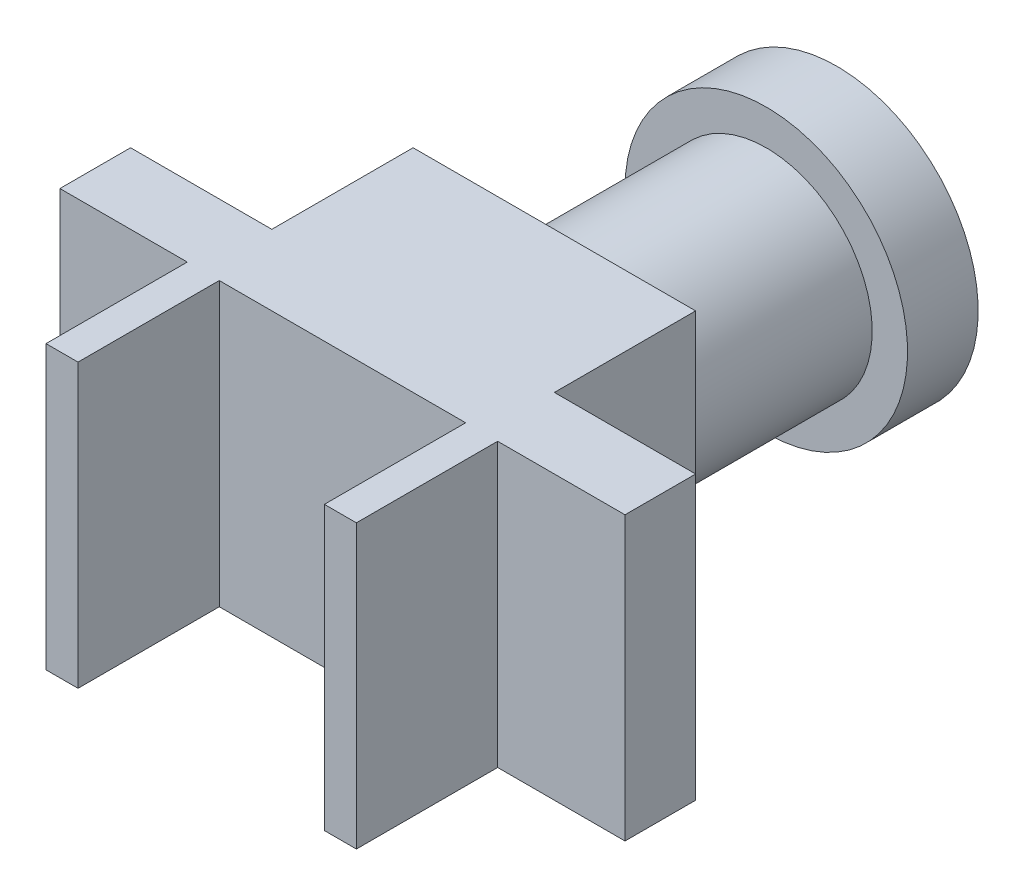
ISO-10303-21;
HEADER;
FILE_DESCRIPTION(('STEP AP214'),'2;1');
FILE_NAME('part.step','',(''),(''),'','','');
FILE_SCHEMA(('AUTOMOTIVE_DESIGN { 1 0 10303 214 1 1 1 1 }'));
ENDSEC;
DATA;
#1=APPLICATION_CONTEXT('core data for automotive mechanical design processes');
#2=APPLICATION_PROTOCOL_DEFINITION('international standard','automotive_design',2000,#1);
#3=PRODUCT_CONTEXT('',#1,'mechanical');
#4=PRODUCT('Part','Part','',(#3));
#5=PRODUCT_RELATED_PRODUCT_CATEGORY('part','',(#4));
#6=PRODUCT_DEFINITION_FORMATION('','',#4);
#7=PRODUCT_DEFINITION_CONTEXT('part definition',#1,'design');
#8=PRODUCT_DEFINITION('design','',#6,#7);
#9=PRODUCT_DEFINITION_SHAPE('','',#8);
#10=(LENGTH_UNIT() NAMED_UNIT(*) SI_UNIT(.MILLI.,.METRE.));
#11=(NAMED_UNIT(*) PLANE_ANGLE_UNIT() SI_UNIT($,.RADIAN.));
#12=(NAMED_UNIT(*) SI_UNIT($,.STERADIAN.) SOLID_ANGLE_UNIT());
#13=UNCERTAINTY_MEASURE_WITH_UNIT(LENGTH_MEASURE(1.E-05),#10,'distance_accuracy_value','');
#14=(GEOMETRIC_REPRESENTATION_CONTEXT(3) GLOBAL_UNCERTAINTY_ASSIGNED_CONTEXT((#13)) GLOBAL_UNIT_ASSIGNED_CONTEXT((#10,
#11,#12)) REPRESENTATION_CONTEXT('',''));
#15=CARTESIAN_POINT('',(0.,0.,0.));
#16=DIRECTION('',(0.,0.,1.));
#17=DIRECTION('',(1.,0.,0.));
#18=AXIS2_PLACEMENT_3D('',#15,#16,#17);
#19=CARTESIAN_POINT('',(0.,0.,45.));
#20=DIRECTION('',(0.,0.,-1.));
#21=DIRECTION('',(-1.,0.,0.));
#22=AXIS2_PLACEMENT_3D('',#19,#20,#21);
#23=PLANE('',#22);
#24=DIRECTION('',(-1.,0.,0.));
#25=VECTOR('',#24,1.);
#26=CARTESIAN_POINT('',(40.,20.,45.));
#27=LINE('',#26,#25);
#28=CARTESIAN_POINT('',(40.,20.,45.));
#29=VERTEX_POINT('',#28);
#30=CARTESIAN_POINT('',(21.9709349152942,20.,45.));
#31=VERTEX_POINT('',#30);
#32=EDGE_CURVE('E212',#29,#31,#27,.T.);
#33=ORIENTED_EDGE('',*,*,#32,.T.);
#34=DIRECTION('',(0.,-1.,0.));
#35=VECTOR('',#34,1.);
#36=CARTESIAN_POINT('',(21.9709349152942,20.,45.));
#37=LINE('',#36,#35);
#38=CARTESIAN_POINT('',(21.9709349152942,-20.,45.));
#39=VERTEX_POINT('',#38);
#40=EDGE_CURVE('E50',#31,#39,#37,.T.);
#41=ORIENTED_EDGE('',*,*,#40,.T.);
#42=DIRECTION('',(1.,0.,0.));
#43=VECTOR('',#42,1.);
#44=CARTESIAN_POINT('',(40.,-20.,45.));
#45=LINE('',#44,#43);
#46=CARTESIAN_POINT('',(40.,-20.,45.));
#47=VERTEX_POINT('',#46);
#48=EDGE_CURVE('E36',#39,#47,#45,.T.);
#49=ORIENTED_EDGE('',*,*,#48,.T.);
#50=DIRECTION('',(0.,1.,0.));
#51=VECTOR('',#50,1.);
#52=CARTESIAN_POINT('',(40.,20.,45.));
#53=LINE('',#52,#51);
#54=EDGE_CURVE('E217',#47,#29,#53,.T.);
#55=ORIENTED_EDGE('',*,*,#54,.T.);
#56=EDGE_LOOP('',(#33,#41,#49,#55));
#57=FACE_BOUND('',#56,.T.);
#58=ADVANCED_FACE('F32',(#57),#23,.F.);
#59=DIRECTION('',(0.,-1.,0.));
#60=VECTOR('',#59,1.);
#61=CARTESIAN_POINT('',(-21.9709349152942,20.,45.));
#62=LINE('',#61,#60);
#63=CARTESIAN_POINT('',(-21.9709349152942,20.,45.));
#64=VERTEX_POINT('',#63);
#65=CARTESIAN_POINT('',(-21.9709349152942,-20.,45.));
#66=VERTEX_POINT('',#65);
#67=EDGE_CURVE('E158',#64,#66,#62,.T.);
#68=ORIENTED_EDGE('',*,*,#67,.F.);
#69=CARTESIAN_POINT('',(-40.,20.,45.));
#70=VERTEX_POINT('',#69);
#71=EDGE_CURVE('E213',#64,#70,#27,.T.);
#72=ORIENTED_EDGE('',*,*,#71,.T.);
#73=DIRECTION('',(0.,-1.,0.));
#74=VECTOR('',#73,1.);
#75=CARTESIAN_POINT('',(-40.,20.,45.));
#76=LINE('',#75,#74);
#77=CARTESIAN_POINT('',(-40.,-20.,45.));
#78=VERTEX_POINT('',#77);
#79=EDGE_CURVE('E231',#70,#78,#76,.T.);
#80=ORIENTED_EDGE('',*,*,#79,.T.);
#81=EDGE_CURVE('E228',#78,#66,#45,.T.);
#82=ORIENTED_EDGE('',*,*,#81,.T.);
#83=EDGE_LOOP('',(#68,#72,#80,#82));
#84=FACE_BOUND('',#83,.T.);
#85=ADVANCED_FACE('F370',(#84),#23,.F.);
#86=CARTESIAN_POINT('',(-17.4394295890148,-20.,45.));
#87=VERTEX_POINT('',#86);
#88=CARTESIAN_POINT('',(17.4394295890148,-20.,45.));
#89=VERTEX_POINT('',#88);
#90=EDGE_CURVE('E58',#87,#89,#45,.T.);
#91=ORIENTED_EDGE('',*,*,#90,.T.);
#92=DIRECTION('',(0.,1.,0.));
#93=VECTOR('',#92,1.);
#94=CARTESIAN_POINT('',(17.4394295890148,20.,45.));
#95=LINE('',#94,#93);
#96=CARTESIAN_POINT('',(17.4394295890148,20.,45.));
#97=VERTEX_POINT('',#96);
#98=EDGE_CURVE('E169',#89,#97,#95,.T.);
#99=ORIENTED_EDGE('',*,*,#98,.T.);
#100=CARTESIAN_POINT('',(-17.4394295890148,20.,45.));
#101=VERTEX_POINT('',#100);
#102=EDGE_CURVE('E210',#97,#101,#27,.T.);
#103=ORIENTED_EDGE('',*,*,#102,.T.);
#104=DIRECTION('',(0.,1.,0.));
#105=VECTOR('',#104,1.);
#106=CARTESIAN_POINT('',(-17.4394295890148,20.,45.));
#107=LINE('',#106,#105);
#108=EDGE_CURVE('E189',#87,#101,#107,.T.);
#109=ORIENTED_EDGE('',*,*,#108,.F.);
#110=EDGE_LOOP('',(#91,#99,#103,#109));
#111=FACE_BOUND('',#110,.T.);
#112=ADVANCED_FACE('F368',(#111),#23,.F.);
#113=CARTESIAN_POINT('',(0.,0.,15.));
#114=DIRECTION('',(0.,0.,-1.));
#115=DIRECTION('',(-1.,0.,0.));
#116=AXIS2_PLACEMENT_3D('',#113,#114,#115);
#117=CYLINDRICAL_SURFACE('',#116,15.);
#118=CARTESIAN_POINT('',(0.,0.,15.));
#119=DIRECTION('',(0.,0.,1.));
#120=DIRECTION('',(1.,0.,0.));
#121=AXIS2_PLACEMENT_3D('',#118,#119,#120);
#122=CIRCLE('',#121,15.);
#123=CARTESIAN_POINT('',(15.,0.,15.));
#124=VERTEX_POINT('',#123);
#125=EDGE_CURVE('E11',#124,#124,#122,.T.);
#126=ORIENTED_EDGE('',*,*,#125,.F.);
#127=EDGE_LOOP('',(#126));
#128=FACE_BOUND('',#127,.T.);
#129=CARTESIAN_POINT('',(0.,0.,-15.));
#130=DIRECTION('',(0.,0.,-1.));
#131=DIRECTION('',(-1.,0.,0.));
#132=AXIS2_PLACEMENT_3D('',#129,#130,#131);
#133=CIRCLE('',#132,15.);
#134=CARTESIAN_POINT('',(-15.,0.,-15.));
#135=VERTEX_POINT('',#134);
#136=EDGE_CURVE('E42',#135,#135,#133,.T.);
#137=ORIENTED_EDGE('',*,*,#136,.F.);
#138=EDGE_LOOP('',(#137));
#139=FACE_BOUND('',#138,.T.);
#140=ADVANCED_FACE('F34',(#128,#139),#117,.T.);
#141=CARTESIAN_POINT('',(0.,0.,-15.));
#142=DIRECTION('',(0.,0.,-1.));
#143=DIRECTION('',(-1.,0.,0.));
#144=AXIS2_PLACEMENT_3D('',#141,#142,#143);
#145=PLANE('',#144);
#146=CARTESIAN_POINT('',(0.,0.,-15.));
#147=DIRECTION('',(0.,0.,-1.));
#148=DIRECTION('',(-1.,0.,0.));
#149=AXIS2_PLACEMENT_3D('',#146,#147,#148);
#150=CIRCLE('',#149,20.);
#151=CARTESIAN_POINT('',(-20.,0.,-15.));
#152=VERTEX_POINT('',#151);
#153=EDGE_CURVE('E289',#152,#152,#150,.T.);
#154=ORIENTED_EDGE('',*,*,#153,.F.);
#155=EDGE_LOOP('',(#154));
#156=FACE_BOUND('',#155,.T.);
#157=ORIENTED_EDGE('',*,*,#136,.T.);
#158=EDGE_LOOP('',(#157));
#159=FACE_BOUND('',#158,.T.);
#160=ADVANCED_FACE('F376',(#156,#159),#145,.F.);
#161=CARTESIAN_POINT('',(0.,0.,-25.));
#162=DIRECTION('',(0.,0.,1.));
#163=DIRECTION('',(1.,0.,0.));
#164=AXIS2_PLACEMENT_3D('',#161,#162,#163);
#165=CYLINDRICAL_SURFACE('',#164,20.);
#166=CARTESIAN_POINT('',(0.,0.,-25.));
#167=DIRECTION('',(0.,0.,-1.));
#168=DIRECTION('',(-1.,0.,0.));
#169=AXIS2_PLACEMENT_3D('',#166,#167,#168);
#170=CIRCLE('',#169,20.);
#171=CARTESIAN_POINT('',(-20.,0.,-25.));
#172=VERTEX_POINT('',#171);
#173=EDGE_CURVE('E286',#172,#172,#170,.T.);
#174=ORIENTED_EDGE('',*,*,#173,.F.);
#175=EDGE_LOOP('',(#174));
#176=FACE_BOUND('',#175,.T.);
#177=ORIENTED_EDGE('',*,*,#153,.T.);
#178=EDGE_LOOP('',(#177));
#179=FACE_BOUND('',#178,.T.);
#180=ADVANCED_FACE('F499',(#176,#179),#165,.T.);
#181=CARTESIAN_POINT('',(0.,0.,-25.));
#182=DIRECTION('',(0.,0.,-1.));
#183=DIRECTION('',(-1.,0.,0.));
#184=AXIS2_PLACEMENT_3D('',#181,#182,#183);
#185=PLANE('',#184);
#186=ORIENTED_EDGE('',*,*,#173,.T.);
#187=EDGE_LOOP('',(#186));
#188=FACE_BOUND('',#187,.T.);
#189=ADVANCED_FACE('F490',(#188),#185,.T.);
#190=CARTESIAN_POINT('',(0.,0.,15.));
#191=DIRECTION('',(0.,0.,-1.));
#192=DIRECTION('',(-1.,0.,0.));
#193=AXIS2_PLACEMENT_3D('',#190,#191,#192);
#194=PLANE('',#193);
#195=DIRECTION('',(0.,-1.,0.));
#196=VECTOR('',#195,1.);
#197=CARTESIAN_POINT('',(-20.,20.,15.));
#198=LINE('',#197,#196);
#199=CARTESIAN_POINT('',(-20.,20.,15.));
#200=VERTEX_POINT('',#199);
#201=CARTESIAN_POINT('',(-20.,-20.,15.));
#202=VERTEX_POINT('',#201);
#203=EDGE_CURVE('E266',#200,#202,#198,.T.);
#204=ORIENTED_EDGE('',*,*,#203,.F.);
#205=DIRECTION('',(-1.,0.,0.));
#206=VECTOR('',#205,1.);
#207=CARTESIAN_POINT('',(20.,20.,15.));
#208=LINE('',#207,#206);
#209=CARTESIAN_POINT('',(20.,20.,15.));
#210=VERTEX_POINT('',#209);
#211=EDGE_CURVE('E283',#210,#200,#208,.T.);
#212=ORIENTED_EDGE('',*,*,#211,.F.);
#213=DIRECTION('',(0.,1.,0.));
#214=VECTOR('',#213,1.);
#215=CARTESIAN_POINT('',(20.,20.,15.));
#216=LINE('',#215,#214);
#217=CARTESIAN_POINT('',(20.,-20.,15.));
#218=VERTEX_POINT('',#217);
#219=EDGE_CURVE('E276',#218,#210,#216,.T.);
#220=ORIENTED_EDGE('',*,*,#219,.F.);
#221=DIRECTION('',(1.,0.,0.));
#222=VECTOR('',#221,1.);
#223=CARTESIAN_POINT('',(20.,-20.,15.));
#224=LINE('',#223,#222);
#225=EDGE_CURVE('E271',#202,#218,#224,.T.);
#226=ORIENTED_EDGE('',*,*,#225,.F.);
#227=EDGE_LOOP('',(#204,#212,#220,#226));
#228=FACE_BOUND('',#227,.T.);
#229=ORIENTED_EDGE('',*,*,#125,.T.);
#230=EDGE_LOOP('',(#229));
#231=FACE_BOUND('',#230,.T.);
#232=ADVANCED_FACE('F329',(#228,#231),#194,.T.);
#233=CARTESIAN_POINT('',(-20.,20.,35.));
#234=DIRECTION('',(1.,0.,0.));
#235=DIRECTION('',(0.,1.,0.));
#236=AXIS2_PLACEMENT_3D('',#233,#234,#235);
#237=PLANE('',#236);
#238=ORIENTED_EDGE('',*,*,#203,.T.);
#239=DIRECTION('',(0.,0.,-1.));
#240=VECTOR('',#239,1.);
#241=CARTESIAN_POINT('',(-20.,-20.,35.));
#242=LINE('',#241,#240);
#243=CARTESIAN_POINT('',(-20.,-20.,35.));
#244=VERTEX_POINT('',#243);
#245=EDGE_CURVE('E292',#244,#202,#242,.T.);
#246=ORIENTED_EDGE('',*,*,#245,.F.);
#247=DIRECTION('',(0.,-1.,0.));
#248=VECTOR('',#247,1.);
#249=CARTESIAN_POINT('',(-20.,20.,35.));
#250=LINE('',#249,#248);
#251=CARTESIAN_POINT('',(-20.,20.,35.));
#252=VERTEX_POINT('',#251);
#253=EDGE_CURVE('E285',#252,#244,#250,.T.);
#254=ORIENTED_EDGE('',*,*,#253,.F.);
#255=DIRECTION('',(0.,0.,-1.));
#256=VECTOR('',#255,1.);
#257=CARTESIAN_POINT('',(-20.,20.,35.));
#258=LINE('',#257,#256);
#259=EDGE_CURVE('E298',#252,#200,#258,.T.);
#260=ORIENTED_EDGE('',*,*,#259,.T.);
#261=EDGE_LOOP('',(#238,#246,#254,#260));
#262=FACE_BOUND('',#261,.T.);
#263=ADVANCED_FACE('F333',(#262),#237,.F.);
#264=CARTESIAN_POINT('',(20.,-20.,35.));
#265=DIRECTION('',(0.,1.,0.));
#266=DIRECTION('',(-1.,0.,0.));
#267=AXIS2_PLACEMENT_3D('',#264,#265,#266);
#268=PLANE('',#267);
#269=ORIENTED_EDGE('',*,*,#225,.T.);
#270=DIRECTION('',(0.,0.,-1.));
#271=VECTOR('',#270,1.);
#272=CARTESIAN_POINT('',(20.,-20.,35.));
#273=LINE('',#272,#271);
#274=CARTESIAN_POINT('',(20.,-20.,35.));
#275=VERTEX_POINT('',#274);
#276=EDGE_CURVE('E297',#275,#218,#273,.T.);
#277=ORIENTED_EDGE('',*,*,#276,.F.);
#278=DIRECTION('',(1.,0.,0.));
#279=VECTOR('',#278,1.);
#280=CARTESIAN_POINT('',(40.,-20.,35.));
#281=LINE('',#280,#279);
#282=CARTESIAN_POINT('',(40.,-20.,35.));
#283=VERTEX_POINT('',#282);
#284=EDGE_CURVE('E313',#275,#283,#281,.T.);
#285=ORIENTED_EDGE('',*,*,#284,.T.);
#286=DIRECTION('',(0.,0.,-1.));
#287=VECTOR('',#286,1.);
#288=CARTESIAN_POINT('',(40.,-20.,45.));
#289=LINE('',#288,#287);
#290=EDGE_CURVE('E259',#47,#283,#289,.T.);
#291=ORIENTED_EDGE('',*,*,#290,.F.);
#292=ORIENTED_EDGE('',*,*,#48,.F.);
#293=DIRECTION('',(0.,0.,-1.));
#294=VECTOR('',#293,1.);
#295=CARTESIAN_POINT('',(21.9709349152942,-20.,65.));
#296=LINE('',#295,#294);
#297=CARTESIAN_POINT('',(21.9709349152942,-20.,65.));
#298=VERTEX_POINT('',#297);
#299=EDGE_CURVE('E178',#298,#39,#296,.T.);
#300=ORIENTED_EDGE('',*,*,#299,.F.);
#301=DIRECTION('',(-1.,0.,0.));
#302=VECTOR('',#301,1.);
#303=CARTESIAN_POINT('',(21.9709349152942,-20.,65.));
#304=LINE('',#303,#302);
#305=CARTESIAN_POINT('',(17.4394295890148,-20.,65.));
#306=VERTEX_POINT('',#305);
#307=EDGE_CURVE('E168',#298,#306,#304,.T.);
#308=ORIENTED_EDGE('',*,*,#307,.T.);
#309=DIRECTION('',(0.,0.,-1.));
#310=VECTOR('',#309,1.);
#311=CARTESIAN_POINT('',(17.4394295890148,-20.,65.));
#312=LINE('',#311,#310);
#313=EDGE_CURVE('E182',#306,#89,#312,.T.);
#314=ORIENTED_EDGE('',*,*,#313,.T.);
#315=ORIENTED_EDGE('',*,*,#90,.F.);
#316=DIRECTION('',(0.,0.,-1.));
#317=VECTOR('',#316,1.);
#318=CARTESIAN_POINT('',(-17.4394295890148,-20.,65.));
#319=LINE('',#318,#317);
#320=CARTESIAN_POINT('',(-17.4394295890148,-20.,65.));
#321=VERTEX_POINT('',#320);
#322=EDGE_CURVE('E344',#321,#87,#319,.T.);
#323=ORIENTED_EDGE('',*,*,#322,.F.);
#324=DIRECTION('',(1.,0.,0.));
#325=VECTOR('',#324,1.);
#326=CARTESIAN_POINT('',(-21.9709349152942,-20.,65.));
#327=LINE('',#326,#325);
#328=CARTESIAN_POINT('',(-21.9709349152942,-20.,65.));
#329=VERTEX_POINT('',#328);
#330=EDGE_CURVE('E188',#329,#321,#327,.T.);
#331=ORIENTED_EDGE('',*,*,#330,.F.);
#332=DIRECTION('',(0.,0.,-1.));
#333=VECTOR('',#332,1.);
#334=CARTESIAN_POINT('',(-21.9709349152942,-20.,65.));
#335=LINE('',#334,#333);
#336=EDGE_CURVE('E342',#329,#66,#335,.T.);
#337=ORIENTED_EDGE('',*,*,#336,.T.);
#338=ORIENTED_EDGE('',*,*,#81,.F.);
#339=DIRECTION('',(0.,0.,-1.));
#340=VECTOR('',#339,1.);
#341=CARTESIAN_POINT('',(-40.,-20.,45.));
#342=LINE('',#341,#340);
#343=CARTESIAN_POINT('',(-40.,-20.,35.));
#344=VERTEX_POINT('',#343);
#345=EDGE_CURVE('E249',#78,#344,#342,.T.);
#346=ORIENTED_EDGE('',*,*,#345,.T.);
#347=EDGE_CURVE('E314',#344,#244,#281,.T.);
#348=ORIENTED_EDGE('',*,*,#347,.T.);
#349=ORIENTED_EDGE('',*,*,#245,.T.);
#350=EDGE_LOOP('',(#269,#277,#285,#291,#292,#300,#308,#314,#315,#323,#331,#337,#338,#346,#348,#349));
#351=FACE_BOUND('',#350,.T.);
#352=ADVANCED_FACE('F331',(#351),#268,.F.);
#353=CARTESIAN_POINT('',(20.,20.,35.));
#354=DIRECTION('',(-1.,0.,0.));
#355=DIRECTION('',(0.,-1.,0.));
#356=AXIS2_PLACEMENT_3D('',#353,#354,#355);
#357=PLANE('',#356);
#358=ORIENTED_EDGE('',*,*,#219,.T.);
#359=DIRECTION('',(0.,0.,-1.));
#360=VECTOR('',#359,1.);
#361=CARTESIAN_POINT('',(20.,20.,35.));
#362=LINE('',#361,#360);
#363=CARTESIAN_POINT('',(20.,20.,35.));
#364=VERTEX_POINT('',#363);
#365=EDGE_CURVE('E295',#364,#210,#362,.T.);
#366=ORIENTED_EDGE('',*,*,#365,.F.);
#367=DIRECTION('',(0.,1.,0.));
#368=VECTOR('',#367,1.);
#369=CARTESIAN_POINT('',(20.,20.,35.));
#370=LINE('',#369,#368);
#371=EDGE_CURVE('E301',#275,#364,#370,.T.);
#372=ORIENTED_EDGE('',*,*,#371,.F.);
#373=ORIENTED_EDGE('',*,*,#276,.T.);
#374=EDGE_LOOP('',(#358,#366,#372,#373));
#375=FACE_BOUND('',#374,.T.);
#376=ADVANCED_FACE('F325',(#375),#357,.F.);
#377=CARTESIAN_POINT('',(20.,20.,35.));
#378=DIRECTION('',(0.,-1.,0.));
#379=DIRECTION('',(1.,0.,0.));
#380=AXIS2_PLACEMENT_3D('',#377,#378,#379);
#381=PLANE('',#380);
#382=ORIENTED_EDGE('',*,*,#211,.T.);
#383=ORIENTED_EDGE('',*,*,#259,.F.);
#384=DIRECTION('',(-1.,0.,0.));
#385=VECTOR('',#384,1.);
#386=CARTESIAN_POINT('',(40.,20.,35.));
#387=LINE('',#386,#385);
#388=CARTESIAN_POINT('',(-40.,20.,35.));
#389=VERTEX_POINT('',#388);
#390=EDGE_CURVE('E240',#252,#389,#387,.T.);
#391=ORIENTED_EDGE('',*,*,#390,.T.);
#392=DIRECTION('',(0.,0.,-1.));
#393=VECTOR('',#392,1.);
#394=CARTESIAN_POINT('',(-40.,20.,45.));
#395=LINE('',#394,#393);
#396=EDGE_CURVE('E226',#70,#389,#395,.T.);
#397=ORIENTED_EDGE('',*,*,#396,.F.);
#398=ORIENTED_EDGE('',*,*,#71,.F.);
#399=DIRECTION('',(0.,0.,-1.));
#400=VECTOR('',#399,1.);
#401=CARTESIAN_POINT('',(-21.9709349152942,20.,65.));
#402=LINE('',#401,#400);
#403=CARTESIAN_POINT('',(-21.9709349152942,20.,65.));
#404=VERTEX_POINT('',#403);
#405=EDGE_CURVE('E195',#404,#64,#402,.T.);
#406=ORIENTED_EDGE('',*,*,#405,.F.);
#407=DIRECTION('',(-1.,0.,0.));
#408=VECTOR('',#407,1.);
#409=CARTESIAN_POINT('',(-21.9709349152942,20.,65.));
#410=LINE('',#409,#408);
#411=CARTESIAN_POINT('',(-17.4394295890148,20.,65.));
#412=VERTEX_POINT('',#411);
#413=EDGE_CURVE('E193',#412,#404,#410,.T.);
#414=ORIENTED_EDGE('',*,*,#413,.F.);
#415=DIRECTION('',(0.,0.,-1.));
#416=VECTOR('',#415,1.);
#417=CARTESIAN_POINT('',(-17.4394295890148,20.,65.));
#418=LINE('',#417,#416);
#419=EDGE_CURVE('E208',#412,#101,#418,.T.);
#420=ORIENTED_EDGE('',*,*,#419,.T.);
#421=ORIENTED_EDGE('',*,*,#102,.F.);
#422=DIRECTION('',(0.,0.,-1.));
#423=VECTOR('',#422,1.);
#424=CARTESIAN_POINT('',(17.4394295890148,20.,65.));
#425=LINE('',#424,#423);
#426=CARTESIAN_POINT('',(17.4394295890148,20.,65.));
#427=VERTEX_POINT('',#426);
#428=EDGE_CURVE('E159',#427,#97,#425,.T.);
#429=ORIENTED_EDGE('',*,*,#428,.F.);
#430=DIRECTION('',(1.,0.,0.));
#431=VECTOR('',#430,1.);
#432=CARTESIAN_POINT('',(21.9709349152942,20.,65.));
#433=LINE('',#432,#431);
#434=CARTESIAN_POINT('',(21.9709349152942,20.,65.));
#435=VERTEX_POINT('',#434);
#436=EDGE_CURVE('E165',#427,#435,#433,.T.);
#437=ORIENTED_EDGE('',*,*,#436,.T.);
#438=DIRECTION('',(0.,0.,-1.));
#439=VECTOR('',#438,1.);
#440=CARTESIAN_POINT('',(21.9709349152942,20.,65.));
#441=LINE('',#440,#439);
#442=EDGE_CURVE('E149',#435,#31,#441,.T.);
#443=ORIENTED_EDGE('',*,*,#442,.T.);
#444=ORIENTED_EDGE('',*,*,#32,.F.);
#445=DIRECTION('',(0.,0.,-1.));
#446=VECTOR('',#445,1.);
#447=CARTESIAN_POINT('',(40.,20.,45.));
#448=LINE('',#447,#446);
#449=CARTESIAN_POINT('',(40.,20.,35.));
#450=VERTEX_POINT('',#449);
#451=EDGE_CURVE('E258',#29,#450,#448,.T.);
#452=ORIENTED_EDGE('',*,*,#451,.T.);
#453=EDGE_CURVE('E235',#450,#364,#387,.T.);
#454=ORIENTED_EDGE('',*,*,#453,.T.);
#455=ORIENTED_EDGE('',*,*,#365,.T.);
#456=EDGE_LOOP('',(#382,#383,#391,#397,#398,#406,#414,#420,#421,#429,#437,#443,#444,#452,#454,#455));
#457=FACE_BOUND('',#456,.T.);
#458=ADVANCED_FACE('F171',(#457),#381,.F.);
#459=CARTESIAN_POINT('',(0.,0.,35.));
#460=DIRECTION('',(0.,0.,-1.));
#461=DIRECTION('',(-1.,0.,0.));
#462=AXIS2_PLACEMENT_3D('',#459,#460,#461);
#463=PLANE('',#462);
#464=ORIENTED_EDGE('',*,*,#390,.F.);
#465=ORIENTED_EDGE('',*,*,#253,.T.);
#466=ORIENTED_EDGE('',*,*,#347,.F.);
#467=DIRECTION('',(0.,-1.,0.));
#468=VECTOR('',#467,1.);
#469=CARTESIAN_POINT('',(-40.,20.,35.));
#470=LINE('',#469,#468);
#471=EDGE_CURVE('E218',#389,#344,#470,.T.);
#472=ORIENTED_EDGE('',*,*,#471,.F.);
#473=EDGE_LOOP('',(#464,#465,#466,#472));
#474=FACE_BOUND('',#473,.T.);
#475=ADVANCED_FACE('F336',(#474),#463,.T.);
#476=CARTESIAN_POINT('',(-40.,20.,45.));
#477=DIRECTION('',(1.,0.,0.));
#478=DIRECTION('',(0.,1.,0.));
#479=AXIS2_PLACEMENT_3D('',#476,#477,#478);
#480=PLANE('',#479);
#481=ORIENTED_EDGE('',*,*,#471,.T.);
#482=ORIENTED_EDGE('',*,*,#345,.F.);
#483=ORIENTED_EDGE('',*,*,#79,.F.);
#484=ORIENTED_EDGE('',*,*,#396,.T.);
#485=EDGE_LOOP('',(#481,#482,#483,#484));
#486=FACE_BOUND('',#485,.T.);
#487=ADVANCED_FACE('F341',(#486),#480,.F.);
#488=CARTESIAN_POINT('',(40.,20.,45.));
#489=DIRECTION('',(-1.,0.,0.));
#490=DIRECTION('',(0.,-1.,0.));
#491=AXIS2_PLACEMENT_3D('',#488,#489,#490);
#492=PLANE('',#491);
#493=DIRECTION('',(0.,1.,0.));
#494=VECTOR('',#493,1.);
#495=CARTESIAN_POINT('',(40.,20.,35.));
#496=LINE('',#495,#494);
#497=EDGE_CURVE('E245',#283,#450,#496,.T.);
#498=ORIENTED_EDGE('',*,*,#497,.T.);
#499=ORIENTED_EDGE('',*,*,#451,.F.);
#500=ORIENTED_EDGE('',*,*,#54,.F.);
#501=ORIENTED_EDGE('',*,*,#290,.T.);
#502=EDGE_LOOP('',(#498,#499,#500,#501));
#503=FACE_BOUND('',#502,.T.);
#504=ADVANCED_FACE('F319',(#503),#492,.F.);
#505=ORIENTED_EDGE('',*,*,#284,.F.);
#506=ORIENTED_EDGE('',*,*,#371,.T.);
#507=ORIENTED_EDGE('',*,*,#453,.F.);
#508=ORIENTED_EDGE('',*,*,#497,.F.);
#509=EDGE_LOOP('',(#505,#506,#507,#508));
#510=FACE_BOUND('',#509,.T.);
#511=ADVANCED_FACE('F322',(#510),#463,.T.);
#512=CARTESIAN_POINT('',(-21.9709349152942,20.,65.));
#513=DIRECTION('',(1.,0.,0.));
#514=DIRECTION('',(0.,0.,-1.));
#515=AXIS2_PLACEMENT_3D('',#512,#513,#514);
#516=PLANE('',#515);
#517=ORIENTED_EDGE('',*,*,#67,.T.);
#518=ORIENTED_EDGE('',*,*,#336,.F.);
#519=DIRECTION('',(0.,-1.,0.));
#520=VECTOR('',#519,1.);
#521=CARTESIAN_POINT('',(-21.9709349152942,20.,65.));
#522=LINE('',#521,#520);
#523=EDGE_CURVE('E185',#404,#329,#522,.T.);
#524=ORIENTED_EDGE('',*,*,#523,.F.);
#525=ORIENTED_EDGE('',*,*,#405,.T.);
#526=EDGE_LOOP('',(#517,#518,#524,#525));
#527=FACE_BOUND('',#526,.T.);
#528=ADVANCED_FACE('F384',(#527),#516,.F.);
#529=CARTESIAN_POINT('',(-17.4394295890148,20.,65.));
#530=DIRECTION('',(-1.,0.,0.));
#531=DIRECTION('',(0.,0.,1.));
#532=AXIS2_PLACEMENT_3D('',#529,#530,#531);
#533=PLANE('',#532);
#534=ORIENTED_EDGE('',*,*,#108,.T.);
#535=ORIENTED_EDGE('',*,*,#419,.F.);
#536=DIRECTION('',(0.,1.,0.));
#537=VECTOR('',#536,1.);
#538=CARTESIAN_POINT('',(-17.4394295890148,20.,65.));
#539=LINE('',#538,#537);
#540=EDGE_CURVE('E191',#321,#412,#539,.T.);
#541=ORIENTED_EDGE('',*,*,#540,.F.);
#542=ORIENTED_EDGE('',*,*,#322,.T.);
#543=EDGE_LOOP('',(#534,#535,#541,#542));
#544=FACE_BOUND('',#543,.T.);
#545=ADVANCED_FACE('F357',(#544),#533,.F.);
#546=CARTESIAN_POINT('',(0.,0.,65.));
#547=DIRECTION('',(0.,0.,1.));
#548=DIRECTION('',(1.,0.,0.));
#549=AXIS2_PLACEMENT_3D('',#546,#547,#548);
#550=PLANE('',#549);
#551=ORIENTED_EDGE('',*,*,#523,.T.);
#552=ORIENTED_EDGE('',*,*,#330,.T.);
#553=ORIENTED_EDGE('',*,*,#540,.T.);
#554=ORIENTED_EDGE('',*,*,#413,.T.);
#555=EDGE_LOOP('',(#551,#552,#553,#554));
#556=FACE_BOUND('',#555,.T.);
#557=ADVANCED_FACE('F364',(#556),#550,.T.);
#558=CARTESIAN_POINT('',(21.9709349152942,20.,65.));
#559=DIRECTION('',(1.,0.,0.));
#560=DIRECTION('',(0.,0.,-1.));
#561=AXIS2_PLACEMENT_3D('',#558,#559,#560);
#562=PLANE('',#561);
#563=ORIENTED_EDGE('',*,*,#40,.F.);
#564=ORIENTED_EDGE('',*,*,#442,.F.);
#565=DIRECTION('',(0.,-1.,0.));
#566=VECTOR('',#565,1.);
#567=CARTESIAN_POINT('',(21.9709349152942,20.,65.));
#568=LINE('',#567,#566);
#569=EDGE_CURVE('E153',#435,#298,#568,.T.);
#570=ORIENTED_EDGE('',*,*,#569,.T.);
#571=ORIENTED_EDGE('',*,*,#299,.T.);
#572=EDGE_LOOP('',(#563,#564,#570,#571));
#573=FACE_BOUND('',#572,.T.);
#574=ADVANCED_FACE('F151',(#573),#562,.T.);
#575=CARTESIAN_POINT('',(17.4394295890148,20.,65.));
#576=DIRECTION('',(-1.,0.,0.));
#577=DIRECTION('',(0.,0.,1.));
#578=AXIS2_PLACEMENT_3D('',#575,#576,#577);
#579=PLANE('',#578);
#580=ORIENTED_EDGE('',*,*,#98,.F.);
#581=ORIENTED_EDGE('',*,*,#313,.F.);
#582=DIRECTION('',(0.,1.,0.));
#583=VECTOR('',#582,1.);
#584=CARTESIAN_POINT('',(17.4394295890148,20.,65.));
#585=LINE('',#584,#583);
#586=EDGE_CURVE('E173',#306,#427,#585,.T.);
#587=ORIENTED_EDGE('',*,*,#586,.T.);
#588=ORIENTED_EDGE('',*,*,#428,.T.);
#589=EDGE_LOOP('',(#580,#581,#587,#588));
#590=FACE_BOUND('',#589,.T.);
#591=ADVANCED_FACE('F367',(#590),#579,.T.);
#592=CARTESIAN_POINT('',(0.,0.,65.));
#593=DIRECTION('',(0.,0.,1.));
#594=DIRECTION('',(-1.,0.,0.));
#595=AXIS2_PLACEMENT_3D('',#592,#593,#594);
#596=PLANE('',#595);
#597=ORIENTED_EDGE('',*,*,#569,.F.);
#598=ORIENTED_EDGE('',*,*,#436,.F.);
#599=ORIENTED_EDGE('',*,*,#586,.F.);
#600=ORIENTED_EDGE('',*,*,#307,.F.);
#601=EDGE_LOOP('',(#597,#598,#599,#600));
#602=FACE_BOUND('',#601,.T.);
#603=ADVANCED_FACE('F163',(#602),#596,.T.);
#604=CLOSED_SHELL('',(#58,#85,#112,#140,#160,#180,#189,#232,#263,#352,#376,#458,#475,#487,#504,
#511,#528,#545,#557,#574,#591,#603));
#605=MANIFOLD_SOLID_BREP('B2',#604);
#606=ADVANCED_BREP_SHAPE_REPRESENTATION('',(#18,#605),#14);
#607=SHAPE_DEFINITION_REPRESENTATION(#9,#606);
ENDSEC;
END-ISO-10303-21;
